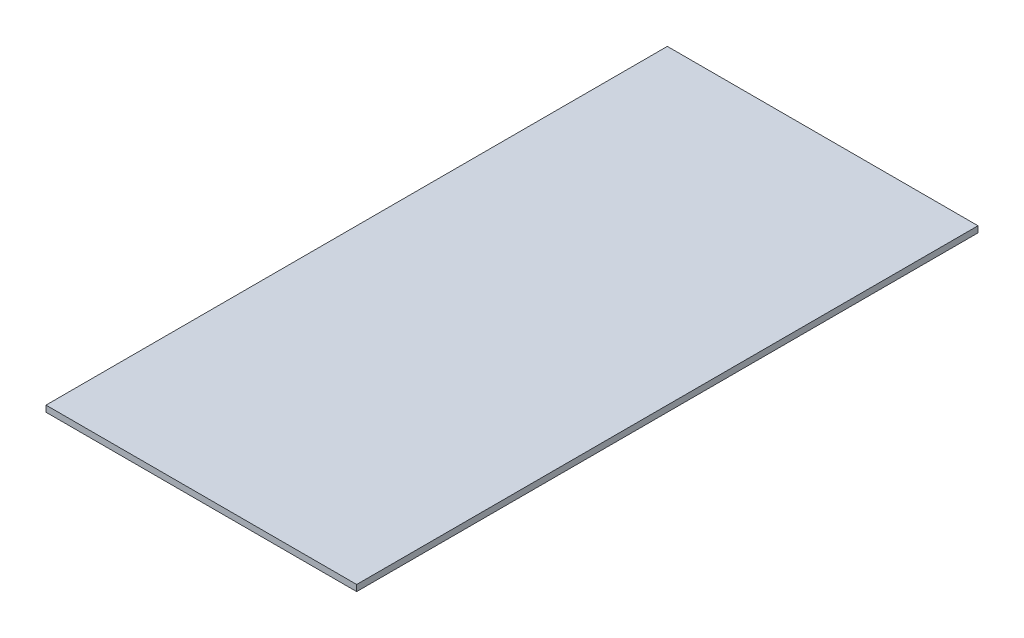
ISO-10303-21;
HEADER;
FILE_DESCRIPTION(('STEP AP214'),'2;1');
FILE_NAME('part.step','',(''),(''),'','','');
FILE_SCHEMA(('AUTOMOTIVE_DESIGN { 1 0 10303 214 1 1 1 1 }'));
ENDSEC;
DATA;
#1=APPLICATION_CONTEXT('core data for automotive mechanical design processes');
#2=APPLICATION_PROTOCOL_DEFINITION('international standard','automotive_design',2000,#1);
#3=PRODUCT_CONTEXT('',#1,'mechanical');
#4=PRODUCT('Part','Part','',(#3));
#5=PRODUCT_RELATED_PRODUCT_CATEGORY('part','',(#4));
#6=PRODUCT_DEFINITION_FORMATION('','',#4);
#7=PRODUCT_DEFINITION_CONTEXT('part definition',#1,'design');
#8=PRODUCT_DEFINITION('design','',#6,#7);
#9=PRODUCT_DEFINITION_SHAPE('','',#8);
#10=(LENGTH_UNIT() NAMED_UNIT(*) SI_UNIT(.MILLI.,.METRE.));
#11=(NAMED_UNIT(*) PLANE_ANGLE_UNIT() SI_UNIT($,.RADIAN.));
#12=(NAMED_UNIT(*) SI_UNIT($,.STERADIAN.) SOLID_ANGLE_UNIT());
#13=UNCERTAINTY_MEASURE_WITH_UNIT(LENGTH_MEASURE(1.E-05),#10,'distance_accuracy_value','');
#14=(GEOMETRIC_REPRESENTATION_CONTEXT(3) GLOBAL_UNCERTAINTY_ASSIGNED_CONTEXT((#13)) GLOBAL_UNIT_ASSIGNED_CONTEXT((#10,
#11,#12)) REPRESENTATION_CONTEXT('',''));
#15=CARTESIAN_POINT('',(0.,0.,0.));
#16=DIRECTION('',(0.,0.,1.));
#17=DIRECTION('',(1.,0.,0.));
#18=AXIS2_PLACEMENT_3D('',#15,#16,#17);
#19=CARTESIAN_POINT('',(0.,3.175,0.));
#20=DIRECTION('',(1.,0.,0.));
#21=DIRECTION('',(0.,0.,-1.));
#22=AXIS2_PLACEMENT_3D('',#19,#20,#21);
#23=PLANE('',#22);
#24=DIRECTION('',(0.,0.,1.));
#25=VECTOR('',#24,1.);
#26=CARTESIAN_POINT('',(0.,0.,0.));
#27=LINE('',#26,#25);
#28=CARTESIAN_POINT('',(0.,0.,-317.5));
#29=VERTEX_POINT('',#28);
#30=CARTESIAN_POINT('',(0.,0.,0.));
#31=VERTEX_POINT('',#30);
#32=EDGE_CURVE('E105',#29,#31,#27,.T.);
#33=ORIENTED_EDGE('',*,*,#32,.T.);
#34=DIRECTION('',(0.,-1.,0.));
#35=VECTOR('',#34,1.);
#36=CARTESIAN_POINT('',(0.,3.175,0.));
#37=LINE('',#36,#35);
#38=CARTESIAN_POINT('',(0.,3.175,0.));
#39=VERTEX_POINT('',#38);
#40=EDGE_CURVE('E11',#39,#31,#37,.T.);
#41=ORIENTED_EDGE('',*,*,#40,.F.);
#42=DIRECTION('',(0.,0.,1.));
#43=VECTOR('',#42,1.);
#44=CARTESIAN_POINT('',(0.,3.175,0.));
#45=LINE('',#44,#43);
#46=CARTESIAN_POINT('',(0.,3.175,-317.5));
#47=VERTEX_POINT('',#46);
#48=EDGE_CURVE('E88',#47,#39,#45,.T.);
#49=ORIENTED_EDGE('',*,*,#48,.F.);
#50=DIRECTION('',(0.,-1.,0.));
#51=VECTOR('',#50,1.);
#52=CARTESIAN_POINT('',(0.,3.175,-317.5));
#53=LINE('',#52,#51);
#54=EDGE_CURVE('E96',#47,#29,#53,.T.);
#55=ORIENTED_EDGE('',*,*,#54,.T.);
#56=EDGE_LOOP('',(#33,#41,#49,#55));
#57=FACE_BOUND('',#56,.T.);
#58=ADVANCED_FACE('F39',(#57),#23,.F.);
#59=CARTESIAN_POINT('',(130.175,3.175,0.));
#60=DIRECTION('',(0.,0.,-1.));
#61=DIRECTION('',(-1.,0.,0.));
#62=AXIS2_PLACEMENT_3D('',#59,#60,#61);
#63=PLANE('',#62);
#64=DIRECTION('',(1.,0.,0.));
#65=VECTOR('',#64,1.);
#66=CARTESIAN_POINT('',(130.175,0.,0.));
#67=LINE('',#66,#65);
#68=CARTESIAN_POINT('',(158.75,0.,0.));
#69=VERTEX_POINT('',#68);
#70=EDGE_CURVE('E93',#31,#69,#67,.T.);
#71=ORIENTED_EDGE('',*,*,#70,.T.);
#72=DIRECTION('',(0.,-1.,0.));
#73=VECTOR('',#72,1.);
#74=CARTESIAN_POINT('',(158.75,3.175,0.));
#75=LINE('',#74,#73);
#76=CARTESIAN_POINT('',(158.75,3.175,0.));
#77=VERTEX_POINT('',#76);
#78=EDGE_CURVE('E50',#77,#69,#75,.T.);
#79=ORIENTED_EDGE('',*,*,#78,.F.);
#80=DIRECTION('',(1.,0.,0.));
#81=VECTOR('',#80,1.);
#82=CARTESIAN_POINT('',(0.,3.175,0.));
#83=LINE('',#82,#81);
#84=EDGE_CURVE('E83',#39,#77,#83,.T.);
#85=ORIENTED_EDGE('',*,*,#84,.F.);
#86=ORIENTED_EDGE('',*,*,#40,.T.);
#87=EDGE_LOOP('',(#71,#79,#85,#86));
#88=FACE_BOUND('',#87,.T.);
#89=ADVANCED_FACE('F92',(#88),#63,.F.);
#90=CARTESIAN_POINT('',(158.75,3.175,0.));
#91=DIRECTION('',(-1.,0.,0.));
#92=DIRECTION('',(0.,0.,1.));
#93=AXIS2_PLACEMENT_3D('',#90,#91,#92);
#94=PLANE('',#93);
#95=DIRECTION('',(0.,0.,-1.));
#96=VECTOR('',#95,1.);
#97=CARTESIAN_POINT('',(158.75,0.,0.));
#98=LINE('',#97,#96);
#99=CARTESIAN_POINT('',(158.75,0.,-317.5));
#100=VERTEX_POINT('',#99);
#101=EDGE_CURVE('E75',#69,#100,#98,.T.);
#102=ORIENTED_EDGE('',*,*,#101,.T.);
#103=DIRECTION('',(0.,-1.,0.));
#104=VECTOR('',#103,1.);
#105=CARTESIAN_POINT('',(158.75,3.175,-317.5));
#106=LINE('',#105,#104);
#107=CARTESIAN_POINT('',(158.75,3.175,-317.5));
#108=VERTEX_POINT('',#107);
#109=EDGE_CURVE('E94',#108,#100,#106,.T.);
#110=ORIENTED_EDGE('',*,*,#109,.F.);
#111=DIRECTION('',(0.,0.,-1.));
#112=VECTOR('',#111,1.);
#113=CARTESIAN_POINT('',(158.75,3.175,0.));
#114=LINE('',#113,#112);
#115=EDGE_CURVE('E89',#77,#108,#114,.T.);
#116=ORIENTED_EDGE('',*,*,#115,.F.);
#117=ORIENTED_EDGE('',*,*,#78,.T.);
#118=EDGE_LOOP('',(#102,#110,#116,#117));
#119=FACE_BOUND('',#118,.T.);
#120=ADVANCED_FACE('F98',(#119),#94,.F.);
#121=CARTESIAN_POINT('',(0.,3.175,-317.5));
#122=DIRECTION('',(0.,0.,1.));
#123=DIRECTION('',(1.,0.,0.));
#124=AXIS2_PLACEMENT_3D('',#121,#122,#123);
#125=PLANE('',#124);
#126=DIRECTION('',(-1.,0.,0.));
#127=VECTOR('',#126,1.);
#128=CARTESIAN_POINT('',(0.,0.,-317.5));
#129=LINE('',#128,#127);
#130=EDGE_CURVE('E76',#100,#29,#129,.T.);
#131=ORIENTED_EDGE('',*,*,#130,.T.);
#132=ORIENTED_EDGE('',*,*,#54,.F.);
#133=DIRECTION('',(-1.,0.,0.));
#134=VECTOR('',#133,1.);
#135=CARTESIAN_POINT('',(0.,3.175,-317.5));
#136=LINE('',#135,#134);
#137=EDGE_CURVE('E54',#108,#47,#136,.T.);
#138=ORIENTED_EDGE('',*,*,#137,.F.);
#139=ORIENTED_EDGE('',*,*,#109,.T.);
#140=EDGE_LOOP('',(#131,#132,#138,#139));
#141=FACE_BOUND('',#140,.T.);
#142=ADVANCED_FACE('F107',(#141),#125,.F.);
#143=CARTESIAN_POINT('',(0.,3.175,0.));
#144=DIRECTION('',(0.,-1.,0.));
#145=DIRECTION('',(0.,0.,-1.));
#146=AXIS2_PLACEMENT_3D('',#143,#144,#145);
#147=PLANE('',#146);
#148=ORIENTED_EDGE('',*,*,#48,.T.);
#149=ORIENTED_EDGE('',*,*,#84,.T.);
#150=ORIENTED_EDGE('',*,*,#115,.T.);
#151=ORIENTED_EDGE('',*,*,#137,.T.);
#152=EDGE_LOOP('',(#148,#149,#150,#151));
#153=FACE_BOUND('',#152,.T.);
#154=ADVANCED_FACE('F87',(#153),#147,.F.);
#155=CARTESIAN_POINT('',(0.,0.,0.));
#156=DIRECTION('',(0.,-1.,0.));
#157=DIRECTION('',(0.,0.,-1.));
#158=AXIS2_PLACEMENT_3D('',#155,#156,#157);
#159=PLANE('',#158);
#160=ORIENTED_EDGE('',*,*,#32,.F.);
#161=ORIENTED_EDGE('',*,*,#130,.F.);
#162=ORIENTED_EDGE('',*,*,#101,.F.);
#163=ORIENTED_EDGE('',*,*,#70,.F.);
#164=EDGE_LOOP('',(#160,#161,#162,#163));
#165=FACE_BOUND('',#164,.T.);
#166=ADVANCED_FACE('F115',(#165),#159,.T.);
#167=CLOSED_SHELL('',(#58,#89,#120,#142,#154,#166));
#168=MANIFOLD_SOLID_BREP('B2',#167);
#169=ADVANCED_BREP_SHAPE_REPRESENTATION('',(#18,#168),#14);
#170=SHAPE_DEFINITION_REPRESENTATION(#9,#169);
ENDSEC;
END-ISO-10303-21;
